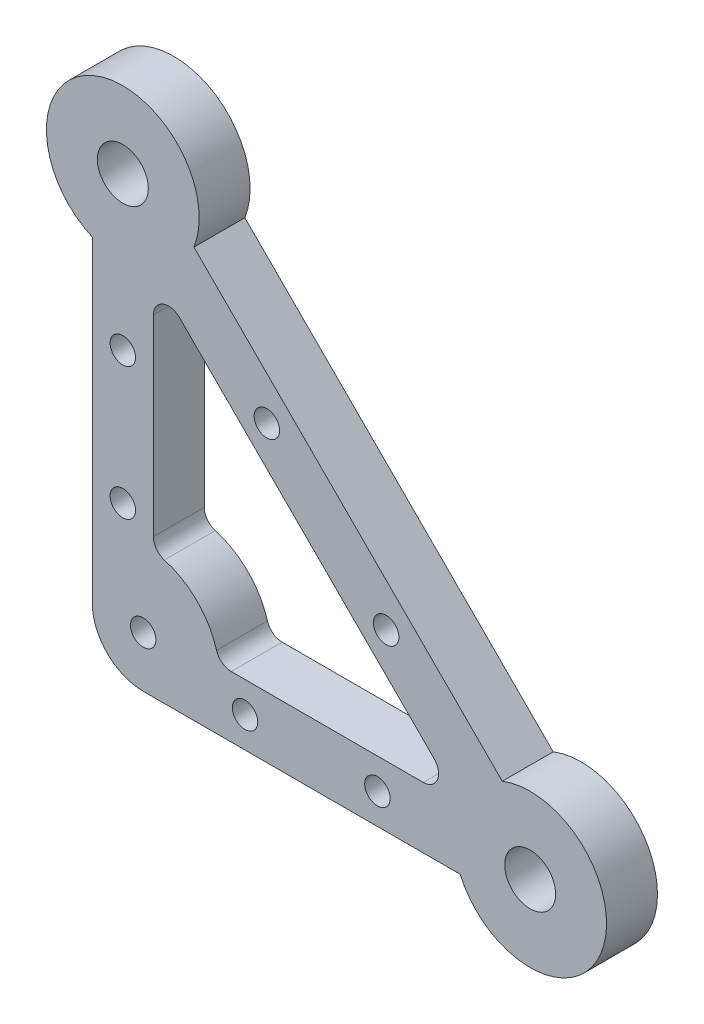
ISO-10303-21;
HEADER;
FILE_DESCRIPTION(('STEP AP214'),'2;1');
FILE_NAME('part.step','',(''),(''),'','','');
FILE_SCHEMA(('AUTOMOTIVE_DESIGN { 1 0 10303 214 1 1 1 1 }'));
ENDSEC;
DATA;
#1=APPLICATION_CONTEXT('core data for automotive mechanical design processes');
#2=APPLICATION_PROTOCOL_DEFINITION('international standard','automotive_design',2000,#1);
#3=PRODUCT_CONTEXT('',#1,'mechanical');
#4=PRODUCT('Part','Part','',(#3));
#5=PRODUCT_RELATED_PRODUCT_CATEGORY('part','',(#4));
#6=PRODUCT_DEFINITION_FORMATION('','',#4);
#7=PRODUCT_DEFINITION_CONTEXT('part definition',#1,'design');
#8=PRODUCT_DEFINITION('design','',#6,#7);
#9=PRODUCT_DEFINITION_SHAPE('','',#8);
#10=(LENGTH_UNIT() NAMED_UNIT(*) SI_UNIT(.MILLI.,.METRE.));
#11=(NAMED_UNIT(*) PLANE_ANGLE_UNIT() SI_UNIT($,.RADIAN.));
#12=(NAMED_UNIT(*) SI_UNIT($,.STERADIAN.) SOLID_ANGLE_UNIT());
#13=UNCERTAINTY_MEASURE_WITH_UNIT(LENGTH_MEASURE(1.E-05),#10,'distance_accuracy_value','');
#14=(GEOMETRIC_REPRESENTATION_CONTEXT(3) GLOBAL_UNCERTAINTY_ASSIGNED_CONTEXT((#13)) GLOBAL_UNIT_ASSIGNED_CONTEXT((#10,
#11,#12)) REPRESENTATION_CONTEXT('',''));
#15=CARTESIAN_POINT('',(0.,0.,0.));
#16=DIRECTION('',(0.,0.,1.));
#17=DIRECTION('',(1.,0.,0.));
#18=AXIS2_PLACEMENT_3D('',#15,#16,#17);
#19=CARTESIAN_POINT('',(4.,-76.,10.));
#20=DIRECTION('',(0.,0.,1.));
#21=DIRECTION('',(1.,0.,0.));
#22=AXIS2_PLACEMENT_3D('',#19,#20,#21);
#23=PLANE('',#22);
#24=CARTESIAN_POINT('',(50.,-80.,10.));
#25=DIRECTION('',(0.,0.,1.));
#26=DIRECTION('',(1.,0.,0.));
#27=AXIS2_PLACEMENT_3D('',#24,#25,#26);
#28=CIRCLE('',#27,2.5);
#29=CARTESIAN_POINT('',(52.5,-80.,10.));
#30=VERTEX_POINT('',#29);
#31=EDGE_CURVE('E364',#30,#30,#28,.T.);
#32=ORIENTED_EDGE('',*,*,#31,.F.);
#33=EDGE_LOOP('',(#32));
#34=FACE_BOUND('',#33,.T.);
#35=CARTESIAN_POINT('',(24.,-80.,10.));
#36=DIRECTION('',(0.,0.,1.));
#37=DIRECTION('',(1.,0.,0.));
#38=AXIS2_PLACEMENT_3D('',#35,#36,#37);
#39=CIRCLE('',#38,2.5);
#40=CARTESIAN_POINT('',(26.5,-80.,10.));
#41=VERTEX_POINT('',#40);
#42=EDGE_CURVE('E376',#41,#41,#39,.T.);
#43=ORIENTED_EDGE('',*,*,#42,.F.);
#44=EDGE_LOOP('',(#43));
#45=FACE_BOUND('',#44,.T.);
#46=CARTESIAN_POINT('',(4.,-76.,10.));
#47=DIRECTION('',(0.,0.,1.));
#48=DIRECTION('',(1.,0.,0.));
#49=AXIS2_PLACEMENT_3D('',#46,#47,#48);
#50=CIRCLE('',#49,2.5);
#51=CARTESIAN_POINT('',(6.50000000000001,-76.,10.));
#52=VERTEX_POINT('',#51);
#53=EDGE_CURVE('E388',#52,#52,#50,.T.);
#54=ORIENTED_EDGE('',*,*,#53,.F.);
#55=EDGE_LOOP('',(#54));
#56=FACE_BOUND('',#55,.T.);
#57=CARTESIAN_POINT('',(0.,-56.,10.));
#58=DIRECTION('',(0.,0.,1.));
#59=DIRECTION('',(1.,0.,0.));
#60=AXIS2_PLACEMENT_3D('',#57,#58,#59);
#61=CIRCLE('',#60,2.5);
#62=CARTESIAN_POINT('',(2.5,-56.,10.));
#63=VERTEX_POINT('',#62);
#64=EDGE_CURVE('E400',#63,#63,#61,.T.);
#65=ORIENTED_EDGE('',*,*,#64,.F.);
#66=EDGE_LOOP('',(#65));
#67=FACE_BOUND('',#66,.T.);
#68=DIRECTION('',(0.,-1.,0.));
#69=VECTOR('',#68,1.);
#70=CARTESIAN_POINT('',(6.,-20.9903677719869,10.));
#71=LINE('',#70,#69);
#72=CARTESIAN_POINT('',(6.,-20.9903677719869,10.));
#73=VERTEX_POINT('',#72);
#74=CARTESIAN_POINT('',(6.,-58.7083835342094,10.));
#75=VERTEX_POINT('',#74);
#76=EDGE_CURVE('E144',#73,#75,#71,.T.);
#77=ORIENTED_EDGE('',*,*,#76,.F.);
#78=CARTESIAN_POINT('',(9.,-20.9903677719868,10.));
#79=DIRECTION('',(0.,0.,1.));
#80=DIRECTION('',(1.,0.,0.));
#81=AXIS2_PLACEMENT_3D('',#78,#79,#80);
#82=CIRCLE('',#81,3.);
#83=CARTESIAN_POINT('',(11.1213203435597,-18.8690474284272,10.));
#84=VERTEX_POINT('',#83);
#85=EDGE_CURVE('E136',#84,#73,#82,.T.);
#86=ORIENTED_EDGE('',*,*,#85,.F.);
#87=DIRECTION('',(-0.707106781186547,0.707106781186548,0.));
#88=VECTOR('',#87,1.);
#89=CARTESIAN_POINT('',(11.1213203435597,-18.8690474284272,10.));
#90=LINE('',#89,#88);
#91=CARTESIAN_POINT('',(61.1309525715728,-68.8786796564403,10.));
#92=VERTEX_POINT('',#91);
#93=EDGE_CURVE('E171',#92,#84,#90,.T.);
#94=ORIENTED_EDGE('',*,*,#93,.F.);
#95=CARTESIAN_POINT('',(59.0096322280132,-71.,10.));
#96=DIRECTION('',(0.,0.,1.));
#97=DIRECTION('',(1.,0.,0.));
#98=AXIS2_PLACEMENT_3D('',#95,#96,#97);
#99=CIRCLE('',#98,3.);
#100=CARTESIAN_POINT('',(59.0096322280131,-74.,10.));
#101=VERTEX_POINT('',#100);
#102=EDGE_CURVE('E169',#101,#92,#99,.T.);
#103=ORIENTED_EDGE('',*,*,#102,.F.);
#104=DIRECTION('',(1.,0.,0.));
#105=VECTOR('',#104,1.);
#106=CARTESIAN_POINT('',(21.2916164657906,-74.,10.));
#107=LINE('',#106,#105);
#108=CARTESIAN_POINT('',(21.2916164657906,-74.,10.));
#109=VERTEX_POINT('',#108);
#110=EDGE_CURVE('E167',#109,#101,#107,.T.);
#111=ORIENTED_EDGE('',*,*,#110,.F.);
#112=CARTESIAN_POINT('',(21.2916164657906,-71.,10.));
#113=DIRECTION('',(0.,0.,1.));
#114=DIRECTION('',(-1.,0.,0.));
#115=AXIS2_PLACEMENT_3D('',#112,#113,#114);
#116=CIRCLE('',#115,3.);
#117=CARTESIAN_POINT('',(18.4096803881588,-71.8333333333333,10.));
#118=VERTEX_POINT('',#117);
#119=EDGE_CURVE('E165',#118,#109,#116,.T.);
#120=ORIENTED_EDGE('',*,*,#119,.F.);
#121=CARTESIAN_POINT('',(4.,-76.,10.));
#122=DIRECTION('',(0.,0.,-1.));
#123=DIRECTION('',(1.,0.,0.));
#124=AXIS2_PLACEMENT_3D('',#121,#122,#123);
#125=CIRCLE('',#124,15.);
#126=CARTESIAN_POINT('',(8.16666666666667,-61.5903196118412,10.));
#127=VERTEX_POINT('',#126);
#128=EDGE_CURVE('E160',#127,#118,#125,.T.);
#129=ORIENTED_EDGE('',*,*,#128,.F.);
#130=CARTESIAN_POINT('',(9.00000000000001,-58.7083835342094,10.));
#131=DIRECTION('',(0.,0.,1.));
#132=DIRECTION('',(1.,0.,0.));
#133=AXIS2_PLACEMENT_3D('',#130,#131,#132);
#134=CIRCLE('',#133,3.);
#135=EDGE_CURVE('E158',#75,#127,#134,.T.);
#136=ORIENTED_EDGE('',*,*,#135,.F.);
#137=EDGE_LOOP('',(#77,#86,#94,#103,#111,#120,#129,#136));
#138=FACE_BOUND('',#137,.T.);
#139=CARTESIAN_POINT('',(4.,-76.,10.));
#140=DIRECTION('',(0.,0.,1.));
#141=DIRECTION('',(1.,0.,0.));
#142=AXIS2_PLACEMENT_3D('',#139,#140,#141);
#143=CIRCLE('',#142,9.99999999999999);
#144=CARTESIAN_POINT('',(-5.99999999999999,-76.,10.));
#145=VERTEX_POINT('',#144);
#146=CARTESIAN_POINT('',(4.,-86.,10.));
#147=VERTEX_POINT('',#146);
#148=EDGE_CURVE('E204',#145,#147,#143,.T.);
#149=ORIENTED_EDGE('',*,*,#148,.T.);
#150=DIRECTION('',(1.,0.,0.));
#151=VECTOR('',#150,1.);
#152=CARTESIAN_POINT('',(4.,-86.,10.));
#153=LINE('',#152,#151);
#154=CARTESIAN_POINT('',(66.2522729151325,-86.,10.));
#155=VERTEX_POINT('',#154);
#156=EDGE_CURVE('E207',#147,#155,#153,.T.);
#157=ORIENTED_EDGE('',*,*,#156,.T.);
#158=CARTESIAN_POINT('',(80.,-80.,10.));
#159=DIRECTION('',(0.,0.,1.));
#160=DIRECTION('',(1.,0.,0.));
#161=AXIS2_PLACEMENT_3D('',#158,#159,#160);
#162=CIRCLE('',#161,15.);
#163=CARTESIAN_POINT('',(74.5215296395075,-66.0362482652689,10.));
#164=VERTEX_POINT('',#163);
#165=EDGE_CURVE('E210',#155,#164,#162,.T.);
#166=ORIENTED_EDGE('',*,*,#165,.T.);
#167=DIRECTION('',(-0.707106781186547,0.707106781186548,0.));
#168=VECTOR('',#167,1.);
#169=CARTESIAN_POINT('',(13.9637517347311,-5.4784703604925,10.));
#170=LINE('',#169,#168);
#171=CARTESIAN_POINT('',(13.9637517347311,-5.47847036049251,10.));
#172=VERTEX_POINT('',#171);
#173=EDGE_CURVE('E212',#164,#172,#170,.T.);
#174=ORIENTED_EDGE('',*,*,#173,.T.);
#175=CARTESIAN_POINT('',(0.,0.,10.));
#176=DIRECTION('',(0.,0.,1.));
#177=DIRECTION('',(1.,0.,0.));
#178=AXIS2_PLACEMENT_3D('',#175,#176,#177);
#179=CIRCLE('',#178,15.);
#180=CARTESIAN_POINT('',(-5.99999999999999,-13.7477270848675,10.));
#181=VERTEX_POINT('',#180);
#182=EDGE_CURVE('E214',#172,#181,#179,.T.);
#183=ORIENTED_EDGE('',*,*,#182,.T.);
#184=DIRECTION('',(0.,-1.,0.));
#185=VECTOR('',#184,1.);
#186=CARTESIAN_POINT('',(-5.99999999999999,-76.,10.));
#187=LINE('',#186,#185);
#188=EDGE_CURVE('E216',#181,#145,#187,.T.);
#189=ORIENTED_EDGE('',*,*,#188,.T.);
#190=EDGE_LOOP('',(#149,#157,#166,#174,#183,#189));
#191=FACE_BOUND('',#190,.T.);
#192=CARTESIAN_POINT('',(0.,0.,10.));
#193=DIRECTION('',(0.,0.,1.));
#194=DIRECTION('',(1.,0.,0.));
#195=AXIS2_PLACEMENT_3D('',#192,#193,#194);
#196=CIRCLE('',#195,5.);
#197=CARTESIAN_POINT('',(5.,0.,10.));
#198=VERTEX_POINT('',#197);
#199=EDGE_CURVE('E174',#198,#198,#196,.T.);
#200=ORIENTED_EDGE('',*,*,#199,.F.);
#201=EDGE_LOOP('',(#200));
#202=FACE_BOUND('',#201,.T.);
#203=CARTESIAN_POINT('',(0.,-30.,10.));
#204=DIRECTION('',(0.,0.,1.));
#205=DIRECTION('',(1.,0.,0.));
#206=AXIS2_PLACEMENT_3D('',#203,#204,#205);
#207=CIRCLE('',#206,2.5);
#208=CARTESIAN_POINT('',(2.5,-30.,10.));
#209=VERTEX_POINT('',#208);
#210=EDGE_CURVE('E394',#209,#209,#207,.T.);
#211=ORIENTED_EDGE('',*,*,#210,.F.);
#212=EDGE_LOOP('',(#211));
#213=FACE_BOUND('',#212,.T.);
#214=CARTESIAN_POINT('',(28.2842712474619,-28.2842712474619,10.));
#215=DIRECTION('',(0.,0.,1.));
#216=DIRECTION('',(1.,0.,0.));
#217=AXIS2_PLACEMENT_3D('',#214,#215,#216);
#218=CIRCLE('',#217,2.50000000000001);
#219=CARTESIAN_POINT('',(30.7842712474619,-28.2842712474619,10.));
#220=VERTEX_POINT('',#219);
#221=EDGE_CURVE('E382',#220,#220,#218,.T.);
#222=ORIENTED_EDGE('',*,*,#221,.F.);
#223=EDGE_LOOP('',(#222));
#224=FACE_BOUND('',#223,.T.);
#225=CARTESIAN_POINT('',(51.7157287525381,-51.7157287525381,10.));
#226=DIRECTION('',(0.,0.,1.));
#227=DIRECTION('',(1.,0.,0.));
#228=AXIS2_PLACEMENT_3D('',#225,#226,#227);
#229=CIRCLE('',#228,2.5);
#230=CARTESIAN_POINT('',(54.2157287525381,-51.7157287525381,10.));
#231=VERTEX_POINT('',#230);
#232=EDGE_CURVE('E370',#231,#231,#229,.T.);
#233=ORIENTED_EDGE('',*,*,#232,.F.);
#234=EDGE_LOOP('',(#233));
#235=FACE_BOUND('',#234,.T.);
#236=CARTESIAN_POINT('',(80.,-80.,10.));
#237=DIRECTION('',(0.,0.,1.));
#238=DIRECTION('',(1.,0.,0.));
#239=AXIS2_PLACEMENT_3D('',#236,#237,#238);
#240=CIRCLE('',#239,5.00000000000001);
#241=CARTESIAN_POINT('',(85.,-80.,10.));
#242=VERTEX_POINT('',#241);
#243=EDGE_CURVE('E355',#242,#242,#240,.T.);
#244=ORIENTED_EDGE('',*,*,#243,.F.);
#245=EDGE_LOOP('',(#244));
#246=FACE_BOUND('',#245,.T.);
#247=ADVANCED_FACE('F35',(#34,#45,#56,#67,#138,#191,#202,#213,#224,#235,#246),#23,.T.);
#248=CARTESIAN_POINT('',(4.,-76.,0.));
#249=DIRECTION('',(0.,0.,1.));
#250=DIRECTION('',(1.,0.,0.));
#251=AXIS2_PLACEMENT_3D('',#248,#249,#250);
#252=PLANE('',#251);
#253=CARTESIAN_POINT('',(4.,-76.,0.));
#254=DIRECTION('',(0.,0.,1.));
#255=DIRECTION('',(1.,0.,0.));
#256=AXIS2_PLACEMENT_3D('',#253,#254,#255);
#257=CIRCLE('',#256,9.99999999999999);
#258=CARTESIAN_POINT('',(-5.99999999999999,-76.,0.));
#259=VERTEX_POINT('',#258);
#260=CARTESIAN_POINT('',(4.,-86.,0.));
#261=VERTEX_POINT('',#260);
#262=EDGE_CURVE('E152',#259,#261,#257,.T.);
#263=ORIENTED_EDGE('',*,*,#262,.F.);
#264=DIRECTION('',(0.,-1.,0.));
#265=VECTOR('',#264,1.);
#266=CARTESIAN_POINT('',(-5.99999999999999,-76.,0.));
#267=LINE('',#266,#265);
#268=CARTESIAN_POINT('',(-5.99999999999999,-13.7477270848675,0.));
#269=VERTEX_POINT('',#268);
#270=EDGE_CURVE('E208',#269,#259,#267,.T.);
#271=ORIENTED_EDGE('',*,*,#270,.F.);
#272=CARTESIAN_POINT('',(0.,0.,0.));
#273=DIRECTION('',(0.,0.,1.));
#274=DIRECTION('',(1.,0.,0.));
#275=AXIS2_PLACEMENT_3D('',#272,#273,#274);
#276=CIRCLE('',#275,15.);
#277=CARTESIAN_POINT('',(13.9637517347311,-5.47847036049251,0.));
#278=VERTEX_POINT('',#277);
#279=EDGE_CURVE('E227',#278,#269,#276,.T.);
#280=ORIENTED_EDGE('',*,*,#279,.F.);
#281=DIRECTION('',(-0.707106781186547,0.707106781186548,0.));
#282=VECTOR('',#281,1.);
#283=CARTESIAN_POINT('',(13.9637517347311,-5.4784703604925,0.));
#284=LINE('',#283,#282);
#285=CARTESIAN_POINT('',(74.5215296395075,-66.0362482652689,0.));
#286=VERTEX_POINT('',#285);
#287=EDGE_CURVE('E225',#286,#278,#284,.T.);
#288=ORIENTED_EDGE('',*,*,#287,.F.);
#289=CARTESIAN_POINT('',(80.,-80.,0.));
#290=DIRECTION('',(0.,0.,1.));
#291=DIRECTION('',(1.,0.,0.));
#292=AXIS2_PLACEMENT_3D('',#289,#290,#291);
#293=CIRCLE('',#292,15.);
#294=CARTESIAN_POINT('',(66.2522729151325,-86.,0.));
#295=VERTEX_POINT('',#294);
#296=EDGE_CURVE('E223',#295,#286,#293,.T.);
#297=ORIENTED_EDGE('',*,*,#296,.F.);
#298=DIRECTION('',(1.,0.,0.));
#299=VECTOR('',#298,1.);
#300=CARTESIAN_POINT('',(4.,-86.,0.));
#301=LINE('',#300,#299);
#302=EDGE_CURVE('E221',#261,#295,#301,.T.);
#303=ORIENTED_EDGE('',*,*,#302,.F.);
#304=EDGE_LOOP('',(#263,#271,#280,#288,#297,#303));
#305=FACE_BOUND('',#304,.T.);
#306=CARTESIAN_POINT('',(9.,-20.9903677719868,0.));
#307=DIRECTION('',(0.,0.,1.));
#308=DIRECTION('',(1.,0.,0.));
#309=AXIS2_PLACEMENT_3D('',#306,#307,#308);
#310=CIRCLE('',#309,3.);
#311=CARTESIAN_POINT('',(11.1213203435597,-18.8690474284272,0.));
#312=VERTEX_POINT('',#311);
#313=CARTESIAN_POINT('',(6.,-20.9903677719869,0.));
#314=VERTEX_POINT('',#313);
#315=EDGE_CURVE('E58',#312,#314,#310,.T.);
#316=ORIENTED_EDGE('',*,*,#315,.T.);
#317=DIRECTION('',(0.,-1.,0.));
#318=VECTOR('',#317,1.);
#319=CARTESIAN_POINT('',(6.,-20.9903677719869,0.));
#320=LINE('',#319,#318);
#321=CARTESIAN_POINT('',(6.,-58.7083835342094,0.));
#322=VERTEX_POINT('',#321);
#323=EDGE_CURVE('E151',#314,#322,#320,.T.);
#324=ORIENTED_EDGE('',*,*,#323,.T.);
#325=CARTESIAN_POINT('',(9.00000000000001,-58.7083835342094,0.));
#326=DIRECTION('',(0.,0.,1.));
#327=DIRECTION('',(1.,0.,0.));
#328=AXIS2_PLACEMENT_3D('',#325,#326,#327);
#329=CIRCLE('',#328,3.);
#330=CARTESIAN_POINT('',(8.16666666666667,-61.5903196118412,0.));
#331=VERTEX_POINT('',#330);
#332=EDGE_CURVE('E176',#322,#331,#329,.T.);
#333=ORIENTED_EDGE('',*,*,#332,.T.);
#334=CARTESIAN_POINT('',(4.,-76.,0.));
#335=DIRECTION('',(0.,0.,-1.));
#336=DIRECTION('',(1.,0.,0.));
#337=AXIS2_PLACEMENT_3D('',#334,#335,#336);
#338=CIRCLE('',#337,15.);
#339=CARTESIAN_POINT('',(18.4096803881588,-71.8333333333333,0.));
#340=VERTEX_POINT('',#339);
#341=EDGE_CURVE('E179',#331,#340,#338,.T.);
#342=ORIENTED_EDGE('',*,*,#341,.T.);
#343=CARTESIAN_POINT('',(21.2916164657906,-71.,0.));
#344=DIRECTION('',(0.,0.,1.));
#345=DIRECTION('',(-1.,0.,0.));
#346=AXIS2_PLACEMENT_3D('',#343,#344,#345);
#347=CIRCLE('',#346,3.);
#348=CARTESIAN_POINT('',(21.2916164657906,-74.,0.));
#349=VERTEX_POINT('',#348);
#350=EDGE_CURVE('E182',#340,#349,#347,.T.);
#351=ORIENTED_EDGE('',*,*,#350,.T.);
#352=DIRECTION('',(1.,0.,0.));
#353=VECTOR('',#352,1.);
#354=CARTESIAN_POINT('',(21.2916164657906,-74.,0.));
#355=LINE('',#354,#353);
#356=CARTESIAN_POINT('',(59.0096322280131,-74.,0.));
#357=VERTEX_POINT('',#356);
#358=EDGE_CURVE('E185',#349,#357,#355,.T.);
#359=ORIENTED_EDGE('',*,*,#358,.T.);
#360=CARTESIAN_POINT('',(59.0096322280132,-71.,0.));
#361=DIRECTION('',(0.,0.,1.));
#362=DIRECTION('',(1.,0.,0.));
#363=AXIS2_PLACEMENT_3D('',#360,#361,#362);
#364=CIRCLE('',#363,3.);
#365=CARTESIAN_POINT('',(61.1309525715728,-68.8786796564403,0.));
#366=VERTEX_POINT('',#365);
#367=EDGE_CURVE('E188',#357,#366,#364,.T.);
#368=ORIENTED_EDGE('',*,*,#367,.T.);
#369=DIRECTION('',(-0.707106781186547,0.707106781186548,0.));
#370=VECTOR('',#369,1.);
#371=CARTESIAN_POINT('',(11.1213203435597,-18.8690474284272,0.));
#372=LINE('',#371,#370);
#373=EDGE_CURVE('E145',#366,#312,#372,.T.);
#374=ORIENTED_EDGE('',*,*,#373,.T.);
#375=EDGE_LOOP('',(#316,#324,#333,#342,#351,#359,#368,#374));
#376=FACE_BOUND('',#375,.T.);
#377=CARTESIAN_POINT('',(0.,0.,0.));
#378=DIRECTION('',(0.,0.,1.));
#379=DIRECTION('',(1.,0.,0.));
#380=AXIS2_PLACEMENT_3D('',#377,#378,#379);
#381=CIRCLE('',#380,5.);
#382=CARTESIAN_POINT('',(5.,0.,0.));
#383=VERTEX_POINT('',#382);
#384=EDGE_CURVE('E403',#383,#383,#381,.T.);
#385=ORIENTED_EDGE('',*,*,#384,.T.);
#386=EDGE_LOOP('',(#385));
#387=FACE_BOUND('',#386,.T.);
#388=CARTESIAN_POINT('',(0.,-56.,0.));
#389=DIRECTION('',(0.,0.,1.));
#390=DIRECTION('',(1.,0.,0.));
#391=AXIS2_PLACEMENT_3D('',#388,#389,#390);
#392=CIRCLE('',#391,2.5);
#393=CARTESIAN_POINT('',(2.5,-56.,0.));
#394=VERTEX_POINT('',#393);
#395=EDGE_CURVE('E397',#394,#394,#392,.T.);
#396=ORIENTED_EDGE('',*,*,#395,.T.);
#397=EDGE_LOOP('',(#396));
#398=FACE_BOUND('',#397,.T.);
#399=CARTESIAN_POINT('',(0.,-30.,0.));
#400=DIRECTION('',(0.,0.,1.));
#401=DIRECTION('',(1.,0.,0.));
#402=AXIS2_PLACEMENT_3D('',#399,#400,#401);
#403=CIRCLE('',#402,2.5);
#404=CARTESIAN_POINT('',(2.5,-30.,0.));
#405=VERTEX_POINT('',#404);
#406=EDGE_CURVE('E391',#405,#405,#403,.T.);
#407=ORIENTED_EDGE('',*,*,#406,.T.);
#408=EDGE_LOOP('',(#407));
#409=FACE_BOUND('',#408,.T.);
#410=CARTESIAN_POINT('',(4.,-76.,0.));
#411=DIRECTION('',(0.,0.,1.));
#412=DIRECTION('',(1.,0.,0.));
#413=AXIS2_PLACEMENT_3D('',#410,#411,#412);
#414=CIRCLE('',#413,2.5);
#415=CARTESIAN_POINT('',(6.50000000000001,-76.,0.));
#416=VERTEX_POINT('',#415);
#417=EDGE_CURVE('E385',#416,#416,#414,.T.);
#418=ORIENTED_EDGE('',*,*,#417,.T.);
#419=EDGE_LOOP('',(#418));
#420=FACE_BOUND('',#419,.T.);
#421=CARTESIAN_POINT('',(28.2842712474619,-28.2842712474619,0.));
#422=DIRECTION('',(0.,0.,1.));
#423=DIRECTION('',(1.,0.,0.));
#424=AXIS2_PLACEMENT_3D('',#421,#422,#423);
#425=CIRCLE('',#424,2.50000000000001);
#426=CARTESIAN_POINT('',(30.7842712474619,-28.2842712474619,0.));
#427=VERTEX_POINT('',#426);
#428=EDGE_CURVE('E379',#427,#427,#425,.T.);
#429=ORIENTED_EDGE('',*,*,#428,.T.);
#430=EDGE_LOOP('',(#429));
#431=FACE_BOUND('',#430,.T.);
#432=CARTESIAN_POINT('',(24.,-80.,0.));
#433=DIRECTION('',(0.,0.,1.));
#434=DIRECTION('',(1.,0.,0.));
#435=AXIS2_PLACEMENT_3D('',#432,#433,#434);
#436=CIRCLE('',#435,2.5);
#437=CARTESIAN_POINT('',(26.5,-80.,0.));
#438=VERTEX_POINT('',#437);
#439=EDGE_CURVE('E373',#438,#438,#436,.T.);
#440=ORIENTED_EDGE('',*,*,#439,.T.);
#441=EDGE_LOOP('',(#440));
#442=FACE_BOUND('',#441,.T.);
#443=CARTESIAN_POINT('',(51.7157287525381,-51.7157287525381,0.));
#444=DIRECTION('',(0.,0.,1.));
#445=DIRECTION('',(1.,0.,0.));
#446=AXIS2_PLACEMENT_3D('',#443,#444,#445);
#447=CIRCLE('',#446,2.5);
#448=CARTESIAN_POINT('',(54.2157287525381,-51.7157287525381,0.));
#449=VERTEX_POINT('',#448);
#450=EDGE_CURVE('E367',#449,#449,#447,.T.);
#451=ORIENTED_EDGE('',*,*,#450,.T.);
#452=EDGE_LOOP('',(#451));
#453=FACE_BOUND('',#452,.T.);
#454=CARTESIAN_POINT('',(50.,-80.,0.));
#455=DIRECTION('',(0.,0.,1.));
#456=DIRECTION('',(1.,0.,0.));
#457=AXIS2_PLACEMENT_3D('',#454,#455,#456);
#458=CIRCLE('',#457,2.5);
#459=CARTESIAN_POINT('',(52.5,-80.,0.));
#460=VERTEX_POINT('',#459);
#461=EDGE_CURVE('E361',#460,#460,#458,.T.);
#462=ORIENTED_EDGE('',*,*,#461,.T.);
#463=EDGE_LOOP('',(#462));
#464=FACE_BOUND('',#463,.T.);
#465=CARTESIAN_POINT('',(80.,-80.,0.));
#466=DIRECTION('',(0.,0.,1.));
#467=DIRECTION('',(1.,0.,0.));
#468=AXIS2_PLACEMENT_3D('',#465,#466,#467);
#469=CIRCLE('',#468,5.00000000000001);
#470=CARTESIAN_POINT('',(85.,-80.,0.));
#471=VERTEX_POINT('',#470);
#472=EDGE_CURVE('E358',#471,#471,#469,.T.);
#473=ORIENTED_EDGE('',*,*,#472,.T.);
#474=EDGE_LOOP('',(#473));
#475=FACE_BOUND('',#474,.T.);
#476=ADVANCED_FACE('F251',(#305,#376,#387,#398,#409,#420,#431,#442,#453,#464,#475),#252,.F.);
#477=CARTESIAN_POINT('',(4.,-76.,10.));
#478=DIRECTION('',(0.,0.,-1.));
#479=DIRECTION('',(-1.,0.,0.));
#480=AXIS2_PLACEMENT_3D('',#477,#478,#479);
#481=CYLINDRICAL_SURFACE('',#480,9.99999999999999);
#482=ORIENTED_EDGE('',*,*,#262,.T.);
#483=DIRECTION('',(0.,0.,-1.));
#484=VECTOR('',#483,1.);
#485=CARTESIAN_POINT('',(4.,-86.,10.));
#486=LINE('',#485,#484);
#487=EDGE_CURVE('E11',#147,#261,#486,.T.);
#488=ORIENTED_EDGE('',*,*,#487,.F.);
#489=ORIENTED_EDGE('',*,*,#148,.F.);
#490=DIRECTION('',(0.,0.,-1.));
#491=VECTOR('',#490,1.);
#492=CARTESIAN_POINT('',(-5.99999999999999,-76.,10.));
#493=LINE('',#492,#491);
#494=EDGE_CURVE('E218',#145,#259,#493,.T.);
#495=ORIENTED_EDGE('',*,*,#494,.T.);
#496=EDGE_LOOP('',(#482,#488,#489,#495));
#497=FACE_BOUND('',#496,.T.);
#498=ADVANCED_FACE('F37',(#497),#481,.T.);
#499=CARTESIAN_POINT('',(4.,-86.,10.));
#500=DIRECTION('',(0.,1.,0.));
#501=DIRECTION('',(0.,0.,1.));
#502=AXIS2_PLACEMENT_3D('',#499,#500,#501);
#503=PLANE('',#502);
#504=ORIENTED_EDGE('',*,*,#302,.T.);
#505=DIRECTION('',(0.,0.,-1.));
#506=VECTOR('',#505,1.);
#507=CARTESIAN_POINT('',(66.2522729151325,-86.,10.));
#508=LINE('',#507,#506);
#509=EDGE_CURVE('E43',#155,#295,#508,.T.);
#510=ORIENTED_EDGE('',*,*,#509,.F.);
#511=ORIENTED_EDGE('',*,*,#156,.F.);
#512=ORIENTED_EDGE('',*,*,#487,.T.);
#513=EDGE_LOOP('',(#504,#510,#511,#512));
#514=FACE_BOUND('',#513,.T.);
#515=ADVANCED_FACE('F268',(#514),#503,.F.);
#516=CARTESIAN_POINT('',(80.,-80.,10.));
#517=DIRECTION('',(0.,0.,-1.));
#518=DIRECTION('',(-1.,0.,0.));
#519=AXIS2_PLACEMENT_3D('',#516,#517,#518);
#520=CYLINDRICAL_SURFACE('',#519,15.);
#521=ORIENTED_EDGE('',*,*,#296,.T.);
#522=DIRECTION('',(0.,0.,-1.));
#523=VECTOR('',#522,1.);
#524=CARTESIAN_POINT('',(74.5215296395075,-66.0362482652689,10.));
#525=LINE('',#524,#523);
#526=EDGE_CURVE('E238',#164,#286,#525,.T.);
#527=ORIENTED_EDGE('',*,*,#526,.F.);
#528=ORIENTED_EDGE('',*,*,#165,.F.);
#529=ORIENTED_EDGE('',*,*,#509,.T.);
#530=EDGE_LOOP('',(#521,#527,#528,#529));
#531=FACE_BOUND('',#530,.T.);
#532=ADVANCED_FACE('F245',(#531),#520,.T.);
#533=CARTESIAN_POINT('',(13.9637517347311,-5.4784703604925,10.));
#534=DIRECTION('',(-0.707106781186548,-0.707106781186547,0.));
#535=DIRECTION('',(0.707106781186547,-0.707106781186548,0.));
#536=AXIS2_PLACEMENT_3D('',#533,#534,#535);
#537=PLANE('',#536);
#538=ORIENTED_EDGE('',*,*,#287,.T.);
#539=DIRECTION('',(0.,0.,-1.));
#540=VECTOR('',#539,1.);
#541=CARTESIAN_POINT('',(13.9637517347311,-5.47847036049251,10.));
#542=LINE('',#541,#540);
#543=EDGE_CURVE('E235',#172,#278,#542,.T.);
#544=ORIENTED_EDGE('',*,*,#543,.F.);
#545=ORIENTED_EDGE('',*,*,#173,.F.);
#546=ORIENTED_EDGE('',*,*,#526,.T.);
#547=EDGE_LOOP('',(#538,#544,#545,#546));
#548=FACE_BOUND('',#547,.T.);
#549=ADVANCED_FACE('F257',(#548),#537,.F.);
#550=CARTESIAN_POINT('',(0.,0.,10.));
#551=DIRECTION('',(0.,0.,-1.));
#552=DIRECTION('',(-1.,0.,0.));
#553=AXIS2_PLACEMENT_3D('',#550,#551,#552);
#554=CYLINDRICAL_SURFACE('',#553,15.);
#555=ORIENTED_EDGE('',*,*,#279,.T.);
#556=DIRECTION('',(0.,0.,-1.));
#557=VECTOR('',#556,1.);
#558=CARTESIAN_POINT('',(-5.99999999999999,-13.7477270848675,10.));
#559=LINE('',#558,#557);
#560=EDGE_CURVE('E232',#181,#269,#559,.T.);
#561=ORIENTED_EDGE('',*,*,#560,.F.);
#562=ORIENTED_EDGE('',*,*,#182,.F.);
#563=ORIENTED_EDGE('',*,*,#543,.T.);
#564=EDGE_LOOP('',(#555,#561,#562,#563));
#565=FACE_BOUND('',#564,.T.);
#566=ADVANCED_FACE('F261',(#565),#554,.T.);
#567=CARTESIAN_POINT('',(-5.99999999999999,-76.,10.));
#568=DIRECTION('',(1.,0.,0.));
#569=DIRECTION('',(0.,0.,-1.));
#570=AXIS2_PLACEMENT_3D('',#567,#568,#569);
#571=PLANE('',#570);
#572=ORIENTED_EDGE('',*,*,#270,.T.);
#573=ORIENTED_EDGE('',*,*,#494,.F.);
#574=ORIENTED_EDGE('',*,*,#188,.F.);
#575=ORIENTED_EDGE('',*,*,#560,.T.);
#576=EDGE_LOOP('',(#572,#573,#574,#575));
#577=FACE_BOUND('',#576,.T.);
#578=ADVANCED_FACE('F271',(#577),#571,.F.);
#579=CARTESIAN_POINT('',(9.,-20.9903677719868,10.));
#580=DIRECTION('',(0.,0.,-1.));
#581=DIRECTION('',(-1.,0.,0.));
#582=AXIS2_PLACEMENT_3D('',#579,#580,#581);
#583=CYLINDRICAL_SURFACE('',#582,3.);
#584=ORIENTED_EDGE('',*,*,#315,.F.);
#585=DIRECTION('',(0.,0.,-1.));
#586=VECTOR('',#585,1.);
#587=CARTESIAN_POINT('',(11.1213203435597,-18.8690474284272,10.));
#588=LINE('',#587,#586);
#589=EDGE_CURVE('E140',#84,#312,#588,.T.);
#590=ORIENTED_EDGE('',*,*,#589,.F.);
#591=ORIENTED_EDGE('',*,*,#85,.T.);
#592=DIRECTION('',(0.,0.,-1.));
#593=VECTOR('',#592,1.);
#594=CARTESIAN_POINT('',(6.,-20.9903677719869,10.));
#595=LINE('',#594,#593);
#596=EDGE_CURVE('E139',#73,#314,#595,.T.);
#597=ORIENTED_EDGE('',*,*,#596,.T.);
#598=EDGE_LOOP('',(#584,#590,#591,#597));
#599=FACE_BOUND('',#598,.T.);
#600=ADVANCED_FACE('F138',(#599),#583,.F.);
#601=CARTESIAN_POINT('',(6.,-20.9903677719869,10.));
#602=DIRECTION('',(1.,0.,0.));
#603=DIRECTION('',(0.,1.,0.));
#604=AXIS2_PLACEMENT_3D('',#601,#602,#603);
#605=PLANE('',#604);
#606=ORIENTED_EDGE('',*,*,#323,.F.);
#607=ORIENTED_EDGE('',*,*,#596,.F.);
#608=ORIENTED_EDGE('',*,*,#76,.T.);
#609=DIRECTION('',(0.,0.,-1.));
#610=VECTOR('',#609,1.);
#611=CARTESIAN_POINT('',(6.,-58.7083835342094,10.));
#612=LINE('',#611,#610);
#613=EDGE_CURVE('E153',#75,#322,#612,.T.);
#614=ORIENTED_EDGE('',*,*,#613,.T.);
#615=EDGE_LOOP('',(#606,#607,#608,#614));
#616=FACE_BOUND('',#615,.T.);
#617=ADVANCED_FACE('F148',(#616),#605,.T.);
#618=CARTESIAN_POINT('',(9.00000000000001,-58.7083835342094,10.));
#619=DIRECTION('',(0.,0.,-1.));
#620=DIRECTION('',(-1.,0.,0.));
#621=AXIS2_PLACEMENT_3D('',#618,#619,#620);
#622=CYLINDRICAL_SURFACE('',#621,3.);
#623=ORIENTED_EDGE('',*,*,#332,.F.);
#624=ORIENTED_EDGE('',*,*,#613,.F.);
#625=ORIENTED_EDGE('',*,*,#135,.T.);
#626=DIRECTION('',(0.,0.,-1.));
#627=VECTOR('',#626,1.);
#628=CARTESIAN_POINT('',(8.16666666666667,-61.5903196118412,10.));
#629=LINE('',#628,#627);
#630=EDGE_CURVE('E201',#127,#331,#629,.T.);
#631=ORIENTED_EDGE('',*,*,#630,.T.);
#632=EDGE_LOOP('',(#623,#624,#625,#631));
#633=FACE_BOUND('',#632,.T.);
#634=ADVANCED_FACE('F292',(#633),#622,.F.);
#635=CARTESIAN_POINT('',(4.,-76.,10.));
#636=DIRECTION('',(0.,0.,-1.));
#637=DIRECTION('',(-1.,0.,0.));
#638=AXIS2_PLACEMENT_3D('',#635,#636,#637);
#639=CYLINDRICAL_SURFACE('',#638,15.);
#640=ORIENTED_EDGE('',*,*,#341,.F.);
#641=ORIENTED_EDGE('',*,*,#630,.F.);
#642=ORIENTED_EDGE('',*,*,#128,.T.);
#643=DIRECTION('',(0.,0.,-1.));
#644=VECTOR('',#643,1.);
#645=CARTESIAN_POINT('',(18.4096803881588,-71.8333333333333,10.));
#646=LINE('',#645,#644);
#647=EDGE_CURVE('E199',#118,#340,#646,.T.);
#648=ORIENTED_EDGE('',*,*,#647,.T.);
#649=EDGE_LOOP('',(#640,#641,#642,#648));
#650=FACE_BOUND('',#649,.T.);
#651=ADVANCED_FACE('F295',(#650),#639,.T.);
#652=CARTESIAN_POINT('',(21.2916164657906,-71.,10.));
#653=DIRECTION('',(0.,0.,-1.));
#654=DIRECTION('',(-1.,0.,0.));
#655=AXIS2_PLACEMENT_3D('',#652,#653,#654);
#656=CYLINDRICAL_SURFACE('',#655,3.);
#657=ORIENTED_EDGE('',*,*,#350,.F.);
#658=ORIENTED_EDGE('',*,*,#647,.F.);
#659=ORIENTED_EDGE('',*,*,#119,.T.);
#660=DIRECTION('',(0.,0.,-1.));
#661=VECTOR('',#660,1.);
#662=CARTESIAN_POINT('',(21.2916164657906,-74.,10.));
#663=LINE('',#662,#661);
#664=EDGE_CURVE('E197',#109,#349,#663,.T.);
#665=ORIENTED_EDGE('',*,*,#664,.T.);
#666=EDGE_LOOP('',(#657,#658,#659,#665));
#667=FACE_BOUND('',#666,.T.);
#668=ADVANCED_FACE('F299',(#667),#656,.F.);
#669=CARTESIAN_POINT('',(21.2916164657906,-74.,10.));
#670=DIRECTION('',(0.,1.,0.));
#671=DIRECTION('',(0.,0.,1.));
#672=AXIS2_PLACEMENT_3D('',#669,#670,#671);
#673=PLANE('',#672);
#674=ORIENTED_EDGE('',*,*,#358,.F.);
#675=ORIENTED_EDGE('',*,*,#664,.F.);
#676=ORIENTED_EDGE('',*,*,#110,.T.);
#677=DIRECTION('',(0.,0.,-1.));
#678=VECTOR('',#677,1.);
#679=CARTESIAN_POINT('',(59.0096322280131,-74.,10.));
#680=LINE('',#679,#678);
#681=EDGE_CURVE('E195',#101,#357,#680,.T.);
#682=ORIENTED_EDGE('',*,*,#681,.T.);
#683=EDGE_LOOP('',(#674,#675,#676,#682));
#684=FACE_BOUND('',#683,.T.);
#685=ADVANCED_FACE('F303',(#684),#673,.T.);
#686=CARTESIAN_POINT('',(59.0096322280132,-71.,10.));
#687=DIRECTION('',(0.,0.,-1.));
#688=DIRECTION('',(-1.,0.,0.));
#689=AXIS2_PLACEMENT_3D('',#686,#687,#688);
#690=CYLINDRICAL_SURFACE('',#689,3.);
#691=ORIENTED_EDGE('',*,*,#367,.F.);
#692=ORIENTED_EDGE('',*,*,#681,.F.);
#693=ORIENTED_EDGE('',*,*,#102,.T.);
#694=DIRECTION('',(0.,0.,-1.));
#695=VECTOR('',#694,1.);
#696=CARTESIAN_POINT('',(61.1309525715728,-68.8786796564403,10.));
#697=LINE('',#696,#695);
#698=EDGE_CURVE('E50',#92,#366,#697,.T.);
#699=ORIENTED_EDGE('',*,*,#698,.T.);
#700=EDGE_LOOP('',(#691,#692,#693,#699));
#701=FACE_BOUND('',#700,.T.);
#702=ADVANCED_FACE('F307',(#701),#690,.F.);
#703=CARTESIAN_POINT('',(11.1213203435597,-18.8690474284272,10.));
#704=DIRECTION('',(-0.707106781186548,-0.707106781186547,0.));
#705=DIRECTION('',(0.707106781186547,-0.707106781186548,0.));
#706=AXIS2_PLACEMENT_3D('',#703,#704,#705);
#707=PLANE('',#706);
#708=ORIENTED_EDGE('',*,*,#373,.F.);
#709=ORIENTED_EDGE('',*,*,#698,.F.);
#710=ORIENTED_EDGE('',*,*,#93,.T.);
#711=ORIENTED_EDGE('',*,*,#589,.T.);
#712=EDGE_LOOP('',(#708,#709,#710,#711));
#713=FACE_BOUND('',#712,.T.);
#714=ADVANCED_FACE('F311',(#713),#707,.T.);
#715=CARTESIAN_POINT('',(0.,0.,10.));
#716=DIRECTION('',(0.,0.,-1.));
#717=DIRECTION('',(-1.,0.,0.));
#718=AXIS2_PLACEMENT_3D('',#715,#716,#717);
#719=CYLINDRICAL_SURFACE('',#718,5.);
#720=ORIENTED_EDGE('',*,*,#199,.T.);
#721=EDGE_LOOP('',(#720));
#722=FACE_BOUND('',#721,.T.);
#723=ORIENTED_EDGE('',*,*,#384,.F.);
#724=EDGE_LOOP('',(#723));
#725=FACE_BOUND('',#724,.T.);
#726=ADVANCED_FACE('F315',(#722,#725),#719,.F.);
#727=CARTESIAN_POINT('',(0.,-56.,10.));
#728=DIRECTION('',(0.,0.,-1.));
#729=DIRECTION('',(-1.,0.,0.));
#730=AXIS2_PLACEMENT_3D('',#727,#728,#729);
#731=CYLINDRICAL_SURFACE('',#730,2.5);
#732=ORIENTED_EDGE('',*,*,#64,.T.);
#733=EDGE_LOOP('',(#732));
#734=FACE_BOUND('',#733,.T.);
#735=ORIENTED_EDGE('',*,*,#395,.F.);
#736=EDGE_LOOP('',(#735));
#737=FACE_BOUND('',#736,.T.);
#738=ADVANCED_FACE('F318',(#734,#737),#731,.F.);
#739=CARTESIAN_POINT('',(0.,-30.,10.));
#740=DIRECTION('',(0.,0.,-1.));
#741=DIRECTION('',(-1.,0.,0.));
#742=AXIS2_PLACEMENT_3D('',#739,#740,#741);
#743=CYLINDRICAL_SURFACE('',#742,2.5);
#744=ORIENTED_EDGE('',*,*,#210,.T.);
#745=EDGE_LOOP('',(#744));
#746=FACE_BOUND('',#745,.T.);
#747=ORIENTED_EDGE('',*,*,#406,.F.);
#748=EDGE_LOOP('',(#747));
#749=FACE_BOUND('',#748,.T.);
#750=ADVANCED_FACE('F322',(#746,#749),#743,.F.);
#751=CARTESIAN_POINT('',(4.,-76.,10.));
#752=DIRECTION('',(0.,0.,-1.));
#753=DIRECTION('',(-1.,0.,0.));
#754=AXIS2_PLACEMENT_3D('',#751,#752,#753);
#755=CYLINDRICAL_SURFACE('',#754,2.5);
#756=ORIENTED_EDGE('',*,*,#53,.T.);
#757=EDGE_LOOP('',(#756));
#758=FACE_BOUND('',#757,.T.);
#759=ORIENTED_EDGE('',*,*,#417,.F.);
#760=EDGE_LOOP('',(#759));
#761=FACE_BOUND('',#760,.T.);
#762=ADVANCED_FACE('F326',(#758,#761),#755,.F.);
#763=CARTESIAN_POINT('',(28.2842712474619,-28.2842712474619,10.));
#764=DIRECTION('',(0.,0.,-1.));
#765=DIRECTION('',(-1.,0.,0.));
#766=AXIS2_PLACEMENT_3D('',#763,#764,#765);
#767=CYLINDRICAL_SURFACE('',#766,2.50000000000001);
#768=ORIENTED_EDGE('',*,*,#221,.T.);
#769=EDGE_LOOP('',(#768));
#770=FACE_BOUND('',#769,.T.);
#771=ORIENTED_EDGE('',*,*,#428,.F.);
#772=EDGE_LOOP('',(#771));
#773=FACE_BOUND('',#772,.T.);
#774=ADVANCED_FACE('F330',(#770,#773),#767,.F.);
#775=CARTESIAN_POINT('',(24.,-80.,10.));
#776=DIRECTION('',(0.,0.,-1.));
#777=DIRECTION('',(-1.,0.,0.));
#778=AXIS2_PLACEMENT_3D('',#775,#776,#777);
#779=CYLINDRICAL_SURFACE('',#778,2.5);
#780=ORIENTED_EDGE('',*,*,#42,.T.);
#781=EDGE_LOOP('',(#780));
#782=FACE_BOUND('',#781,.T.);
#783=ORIENTED_EDGE('',*,*,#439,.F.);
#784=EDGE_LOOP('',(#783));
#785=FACE_BOUND('',#784,.T.);
#786=ADVANCED_FACE('F334',(#782,#785),#779,.F.);
#787=CARTESIAN_POINT('',(51.7157287525381,-51.7157287525381,10.));
#788=DIRECTION('',(0.,0.,-1.));
#789=DIRECTION('',(-1.,0.,0.));
#790=AXIS2_PLACEMENT_3D('',#787,#788,#789);
#791=CYLINDRICAL_SURFACE('',#790,2.5);
#792=ORIENTED_EDGE('',*,*,#232,.T.);
#793=EDGE_LOOP('',(#792));
#794=FACE_BOUND('',#793,.T.);
#795=ORIENTED_EDGE('',*,*,#450,.F.);
#796=EDGE_LOOP('',(#795));
#797=FACE_BOUND('',#796,.T.);
#798=ADVANCED_FACE('F338',(#794,#797),#791,.F.);
#799=CARTESIAN_POINT('',(50.,-80.,10.));
#800=DIRECTION('',(0.,0.,-1.));
#801=DIRECTION('',(-1.,0.,0.));
#802=AXIS2_PLACEMENT_3D('',#799,#800,#801);
#803=CYLINDRICAL_SURFACE('',#802,2.5);
#804=ORIENTED_EDGE('',*,*,#31,.T.);
#805=EDGE_LOOP('',(#804));
#806=FACE_BOUND('',#805,.T.);
#807=ORIENTED_EDGE('',*,*,#461,.F.);
#808=EDGE_LOOP('',(#807));
#809=FACE_BOUND('',#808,.T.);
#810=ADVANCED_FACE('F342',(#806,#809),#803,.F.);
#811=CARTESIAN_POINT('',(80.,-80.,10.));
#812=DIRECTION('',(0.,0.,-1.));
#813=DIRECTION('',(-1.,0.,0.));
#814=AXIS2_PLACEMENT_3D('',#811,#812,#813);
#815=CYLINDRICAL_SURFACE('',#814,5.00000000000001);
#816=ORIENTED_EDGE('',*,*,#243,.T.);
#817=EDGE_LOOP('',(#816));
#818=FACE_BOUND('',#817,.T.);
#819=ORIENTED_EDGE('',*,*,#472,.F.);
#820=EDGE_LOOP('',(#819));
#821=FACE_BOUND('',#820,.T.);
#822=ADVANCED_FACE('F346',(#818,#821),#815,.F.);
#823=CLOSED_SHELL('',(#247,#476,#498,#515,#532,#549,#566,#578,#600,#617,#634,#651,#668,#685,
#702,#714,#726,#738,#750,#762,#774,#786,#798,#810,#822));
#824=MANIFOLD_SOLID_BREP('B2',#823);
#825=ADVANCED_BREP_SHAPE_REPRESENTATION('',(#18,#824),#14);
#826=SHAPE_DEFINITION_REPRESENTATION(#9,#825);
ENDSEC;
END-ISO-10303-21;
